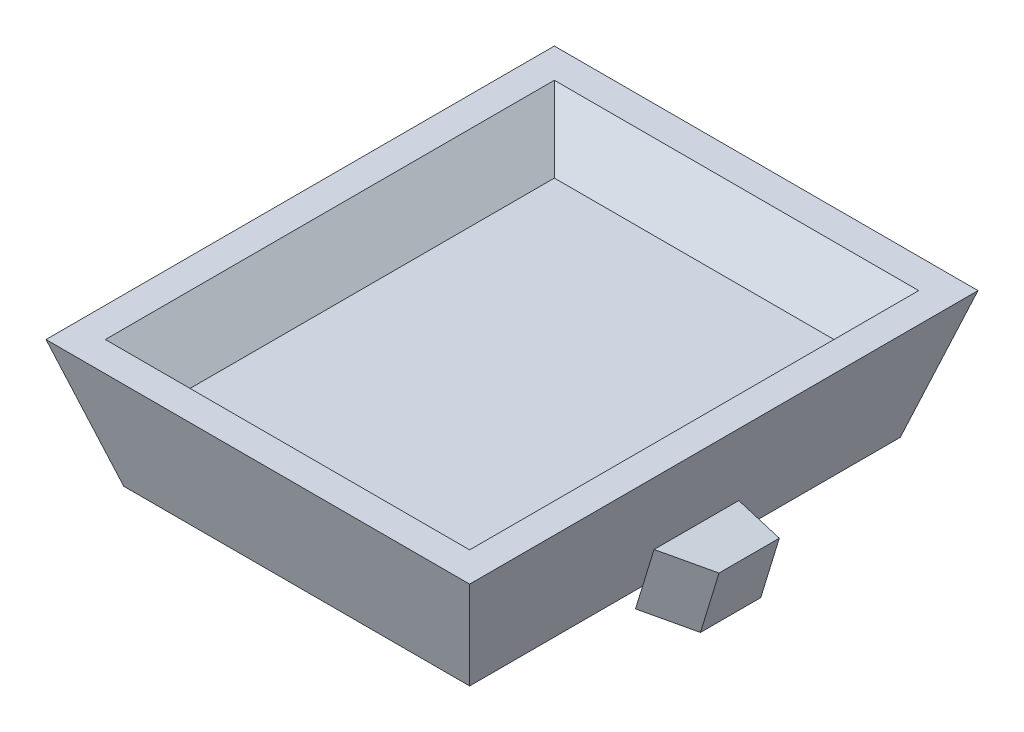
ISO-10303-21;
HEADER;
FILE_DESCRIPTION(('STEP AP214'),'2;1');
FILE_NAME('part.step','',(''),(''),'','','');
FILE_SCHEMA(('AUTOMOTIVE_DESIGN { 1 0 10303 214 1 1 1 1 }'));
ENDSEC;
DATA;
#1=APPLICATION_CONTEXT('core data for automotive mechanical design processes');
#2=APPLICATION_PROTOCOL_DEFINITION('international standard','automotive_design',2000,#1);
#3=PRODUCT_CONTEXT('',#1,'mechanical');
#4=PRODUCT('Part','Part','',(#3));
#5=PRODUCT_RELATED_PRODUCT_CATEGORY('part','',(#4));
#6=PRODUCT_DEFINITION_FORMATION('','',#4);
#7=PRODUCT_DEFINITION_CONTEXT('part definition',#1,'design');
#8=PRODUCT_DEFINITION('design','',#6,#7);
#9=PRODUCT_DEFINITION_SHAPE('','',#8);
#10=(LENGTH_UNIT() NAMED_UNIT(*) SI_UNIT(.MILLI.,.METRE.));
#11=(NAMED_UNIT(*) PLANE_ANGLE_UNIT() SI_UNIT($,.RADIAN.));
#12=(NAMED_UNIT(*) SI_UNIT($,.STERADIAN.) SOLID_ANGLE_UNIT());
#13=UNCERTAINTY_MEASURE_WITH_UNIT(LENGTH_MEASURE(1.E-05),#10,'distance_accuracy_value','');
#14=(GEOMETRIC_REPRESENTATION_CONTEXT(3) GLOBAL_UNCERTAINTY_ASSIGNED_CONTEXT((#13)) GLOBAL_UNIT_ASSIGNED_CONTEXT((#10,
#11,#12)) REPRESENTATION_CONTEXT('',''));
#15=CARTESIAN_POINT('',(0.,0.,0.));
#16=DIRECTION('',(0.,0.,1.));
#17=DIRECTION('',(1.,0.,0.));
#18=AXIS2_PLACEMENT_3D('',#15,#16,#17);
#19=CARTESIAN_POINT('',(50.,0.,-60.));
#20=DIRECTION('',(0.956304755963035,-0.292371704722737,0.));
#21=DIRECTION('',(0.292371704722737,0.956304755963036,0.));
#22=AXIS2_PLACEMENT_3D('',#19,#20,#21);
#23=PLANE('',#22);
#24=DIRECTION('',(0.292371704722737,0.956304755963035,0.));
#25=VECTOR('',#24,1.);
#26=CARTESIAN_POINT('',(39.1475759576145,-35.496679595937,-10.));
#27=LINE('',#26,#25);
#28=CARTESIAN_POINT('',(40.8280795562402,-30.,-10.));
#29=VERTEX_POINT('',#28);
#30=CARTESIAN_POINT('',(43.5331515284555,-21.1521082564914,-10.));
#31=VERTEX_POINT('',#30);
#32=EDGE_CURVE('E11',#29,#31,#27,.T.);
#33=ORIENTED_EDGE('',*,*,#32,.F.);
#34=DIRECTION('',(0.,0.,-1.));
#35=VECTOR('',#34,1.);
#36=CARTESIAN_POINT('',(40.8280795562402,-30.,0.));
#37=LINE('',#36,#35);
#38=CARTESIAN_POINT('',(40.8280795562402,-30.,-50.8280795562402));
#39=VERTEX_POINT('',#38);
#40=EDGE_CURVE('E142',#29,#39,#37,.T.);
#41=ORIENTED_EDGE('',*,*,#40,.T.);
#42=DIRECTION('',(0.280623595142128,0.917878420979061,-0.280623595142128));
#43=VECTOR('',#42,1.);
#44=CARTESIAN_POINT('',(50.,0.,-60.));
#45=LINE('',#44,#43);
#46=CARTESIAN_POINT('',(50.,0.,-60.));
#47=VERTEX_POINT('',#46);
#48=EDGE_CURVE('E200',#39,#47,#45,.T.);
#49=ORIENTED_EDGE('',*,*,#48,.T.);
#50=DIRECTION('',(0.,0.,-1.));
#51=VECTOR('',#50,1.);
#52=CARTESIAN_POINT('',(50.,0.,-60.));
#53=LINE('',#52,#51);
#54=CARTESIAN_POINT('',(50.,0.,60.));
#55=VERTEX_POINT('',#54);
#56=EDGE_CURVE('E185',#55,#47,#53,.T.);
#57=ORIENTED_EDGE('',*,*,#56,.F.);
#58=DIRECTION('',(0.280623595142128,0.917878420979061,0.280623595142128));
#59=VECTOR('',#58,1.);
#60=CARTESIAN_POINT('',(42.1250397849507,-25.7578342398524,52.1250397849507));
#61=LINE('',#60,#59);
#62=CARTESIAN_POINT('',(40.8280795562402,-30.,50.8280795562402));
#63=VERTEX_POINT('',#62);
#64=EDGE_CURVE('E45',#63,#55,#61,.T.);
#65=ORIENTED_EDGE('',*,*,#64,.F.);
#66=CARTESIAN_POINT('',(40.8280795562402,-30.,9.99999999999999));
#67=VERTEX_POINT('',#66);
#68=EDGE_CURVE('E139',#63,#67,#37,.T.);
#69=ORIENTED_EDGE('',*,*,#68,.T.);
#70=DIRECTION('',(-0.292371704722737,-0.956304755963035,0.));
#71=VECTOR('',#70,1.);
#72=CARTESIAN_POINT('',(39.1475759576145,-35.496679595937,9.99999999999999));
#73=LINE('',#72,#71);
#74=CARTESIAN_POINT('',(43.5331515284555,-21.1521082564914,9.99999999999999));
#75=VERTEX_POINT('',#74);
#76=EDGE_CURVE('E149',#75,#67,#73,.T.);
#77=ORIENTED_EDGE('',*,*,#76,.F.);
#78=DIRECTION('',(0.,0.,1.));
#79=VECTOR('',#78,1.);
#80=CARTESIAN_POINT('',(43.5331515284555,-21.1521082564914,9.99999999999999));
#81=LINE('',#80,#79);
#82=EDGE_CURVE('E55',#31,#75,#81,.T.);
#83=ORIENTED_EDGE('',*,*,#82,.F.);
#84=EDGE_LOOP('',(#33,#41,#49,#57,#65,#69,#77,#83));
#85=FACE_BOUND('',#84,.T.);
#86=ADVANCED_FACE('F35',(#85),#23,.T.);
#87=CARTESIAN_POINT('',(-50.,0.,60.));
#88=DIRECTION('',(0.,-0.292371704722737,0.956304755963035));
#89=DIRECTION('',(0.,-0.956304755963035,-0.292371704722737));
#90=AXIS2_PLACEMENT_3D('',#87,#88,#89);
#91=PLANE('',#90);
#92=DIRECTION('',(1.,0.,0.));
#93=VECTOR('',#92,1.);
#94=CARTESIAN_POINT('',(-50.,0.,60.));
#95=LINE('',#94,#93);
#96=CARTESIAN_POINT('',(-50.,0.,60.));
#97=VERTEX_POINT('',#96);
#98=EDGE_CURVE('E195',#97,#55,#95,.T.);
#99=ORIENTED_EDGE('',*,*,#98,.F.);
#100=DIRECTION('',(-0.280623595142128,0.917878420979061,0.280623595142128));
#101=VECTOR('',#100,1.);
#102=CARTESIAN_POINT('',(-40.5500477419409,-30.9094010878228,50.5500477419409));
#103=LINE('',#102,#101);
#104=CARTESIAN_POINT('',(-40.8280795562402,-30.,50.8280795562402));
#105=VERTEX_POINT('',#104);
#106=EDGE_CURVE('E199',#105,#97,#103,.T.);
#107=ORIENTED_EDGE('',*,*,#106,.F.);
#108=DIRECTION('',(1.,0.,0.));
#109=VECTOR('',#108,1.);
#110=CARTESIAN_POINT('',(0.,-30.,50.8280795562402));
#111=LINE('',#110,#109);
#112=EDGE_CURVE('E203',#105,#63,#111,.T.);
#113=ORIENTED_EDGE('',*,*,#112,.T.);
#114=ORIENTED_EDGE('',*,*,#64,.T.);
#115=EDGE_LOOP('',(#99,#107,#113,#114));
#116=FACE_BOUND('',#115,.T.);
#117=ADVANCED_FACE('F257',(#116),#91,.T.);
#118=CARTESIAN_POINT('',(-50.,0.,-60.));
#119=DIRECTION('',(-0.956304755963035,-0.292371704722737,0.));
#120=DIRECTION('',(0.292371704722737,-0.956304755963036,0.));
#121=AXIS2_PLACEMENT_3D('',#118,#119,#120);
#122=PLANE('',#121);
#123=DIRECTION('',(0.,0.,1.));
#124=VECTOR('',#123,1.);
#125=CARTESIAN_POINT('',(-50.,0.,-60.));
#126=LINE('',#125,#124);
#127=CARTESIAN_POINT('',(-50.,0.,-60.));
#128=VERTEX_POINT('',#127);
#129=EDGE_CURVE('E192',#128,#97,#126,.T.);
#130=ORIENTED_EDGE('',*,*,#129,.F.);
#131=DIRECTION('',(-0.280623595142128,0.917878420979061,-0.280623595142128));
#132=VECTOR('',#131,1.);
#133=CARTESIAN_POINT('',(-50.,0.,-60.));
#134=LINE('',#133,#132);
#135=CARTESIAN_POINT('',(-40.8280795562402,-30.,-50.8280795562402));
#136=VERTEX_POINT('',#135);
#137=EDGE_CURVE('E202',#136,#128,#134,.T.);
#138=ORIENTED_EDGE('',*,*,#137,.F.);
#139=DIRECTION('',(0.,0.,1.));
#140=VECTOR('',#139,1.);
#141=CARTESIAN_POINT('',(-40.8280795562402,-30.,0.));
#142=LINE('',#141,#140);
#143=EDGE_CURVE('E207',#136,#105,#142,.T.);
#144=ORIENTED_EDGE('',*,*,#143,.T.);
#145=ORIENTED_EDGE('',*,*,#106,.T.);
#146=EDGE_LOOP('',(#130,#138,#144,#145));
#147=FACE_BOUND('',#146,.T.);
#148=ADVANCED_FACE('F252',(#147),#122,.T.);
#149=CARTESIAN_POINT('',(-50.,0.,-60.));
#150=DIRECTION('',(0.,-0.292371704722737,-0.956304755963035));
#151=DIRECTION('',(0.,0.956304755963035,-0.292371704722737));
#152=AXIS2_PLACEMENT_3D('',#149,#150,#151);
#153=PLANE('',#152);
#154=DIRECTION('',(-1.,0.,0.));
#155=VECTOR('',#154,1.);
#156=CARTESIAN_POINT('',(-50.,0.,-60.));
#157=LINE('',#156,#155);
#158=EDGE_CURVE('E188',#47,#128,#157,.T.);
#159=ORIENTED_EDGE('',*,*,#158,.F.);
#160=ORIENTED_EDGE('',*,*,#48,.F.);
#161=DIRECTION('',(-1.,0.,0.));
#162=VECTOR('',#161,1.);
#163=CARTESIAN_POINT('',(0.,-30.,-50.8280795562402));
#164=LINE('',#163,#162);
#165=EDGE_CURVE('E151',#39,#136,#164,.T.);
#166=ORIENTED_EDGE('',*,*,#165,.T.);
#167=ORIENTED_EDGE('',*,*,#137,.T.);
#168=EDGE_LOOP('',(#159,#160,#166,#167));
#169=FACE_BOUND('',#168,.T.);
#170=ADVANCED_FACE('F248',(#169),#153,.T.);
#171=CARTESIAN_POINT('',(0.,-30.,0.));
#172=DIRECTION('',(0.,1.,0.));
#173=DIRECTION('',(0.,0.,1.));
#174=AXIS2_PLACEMENT_3D('',#171,#172,#173);
#175=PLANE('',#174);
#176=ORIENTED_EDGE('',*,*,#68,.F.);
#177=ORIENTED_EDGE('',*,*,#112,.F.);
#178=ORIENTED_EDGE('',*,*,#143,.F.);
#179=ORIENTED_EDGE('',*,*,#165,.F.);
#180=ORIENTED_EDGE('',*,*,#40,.F.);
#181=EDGE_CURVE('E135',#67,#29,#37,.T.);
#182=ORIENTED_EDGE('',*,*,#181,.F.);
#183=EDGE_LOOP('',(#176,#177,#178,#179,#180,#182));
#184=FACE_BOUND('',#183,.T.);
#185=ADVANCED_FACE('F137',(#184),#175,.F.);
#186=CARTESIAN_POINT('',(0.,0.,0.));
#187=DIRECTION('',(0.,1.,0.));
#188=DIRECTION('',(0.,0.,1.));
#189=AXIS2_PLACEMENT_3D('',#186,#187,#188);
#190=PLANE('',#189);
#191=DIRECTION('',(0.,0.,-1.));
#192=VECTOR('',#191,1.);
#193=CARTESIAN_POINT('',(43.,0.,53.));
#194=LINE('',#193,#192);
#195=CARTESIAN_POINT('',(43.,0.,53.));
#196=VERTEX_POINT('',#195);
#197=CARTESIAN_POINT('',(43.,0.,-53.));
#198=VERTEX_POINT('',#197);
#199=EDGE_CURVE('E173',#196,#198,#194,.T.);
#200=ORIENTED_EDGE('',*,*,#199,.F.);
#201=DIRECTION('',(1.,0.,0.));
#202=VECTOR('',#201,1.);
#203=CARTESIAN_POINT('',(-43.,0.,53.));
#204=LINE('',#203,#202);
#205=CARTESIAN_POINT('',(-43.,0.,53.));
#206=VERTEX_POINT('',#205);
#207=EDGE_CURVE('E181',#206,#196,#204,.T.);
#208=ORIENTED_EDGE('',*,*,#207,.F.);
#209=DIRECTION('',(0.,0.,1.));
#210=VECTOR('',#209,1.);
#211=CARTESIAN_POINT('',(-43.,0.,53.));
#212=LINE('',#211,#210);
#213=CARTESIAN_POINT('',(-43.,0.,-53.));
#214=VERTEX_POINT('',#213);
#215=EDGE_CURVE('E178',#214,#206,#212,.T.);
#216=ORIENTED_EDGE('',*,*,#215,.F.);
#217=DIRECTION('',(-1.,0.,0.));
#218=VECTOR('',#217,1.);
#219=CARTESIAN_POINT('',(-43.,0.,-53.));
#220=LINE('',#219,#218);
#221=EDGE_CURVE('E175',#198,#214,#220,.T.);
#222=ORIENTED_EDGE('',*,*,#221,.F.);
#223=EDGE_LOOP('',(#200,#208,#216,#222));
#224=FACE_BOUND('',#223,.T.);
#225=ORIENTED_EDGE('',*,*,#56,.T.);
#226=ORIENTED_EDGE('',*,*,#158,.T.);
#227=ORIENTED_EDGE('',*,*,#129,.T.);
#228=ORIENTED_EDGE('',*,*,#98,.T.);
#229=EDGE_LOOP('',(#225,#226,#227,#228));
#230=FACE_BOUND('',#229,.T.);
#231=ADVANCED_FACE('F255',(#224,#230),#190,.T.);
#232=CARTESIAN_POINT('',(43.,0.,53.));
#233=DIRECTION('',(-0.707106781186546,0.707106781186549,0.));
#234=DIRECTION('',(-0.707106781186549,-0.707106781186546,0.));
#235=AXIS2_PLACEMENT_3D('',#232,#233,#234);
#236=PLANE('',#235);
#237=ORIENTED_EDGE('',*,*,#199,.T.);
#238=DIRECTION('',(0.577350269189627,0.577350269189624,-0.577350269189627));
#239=VECTOR('',#238,1.);
#240=CARTESIAN_POINT('',(7.66666666666657,-35.3333333333333,-17.6666666666666));
#241=LINE('',#240,#239);
#242=CARTESIAN_POINT('',(33.,-10.,-43.));
#243=VERTEX_POINT('',#242);
#244=EDGE_CURVE('E216',#243,#198,#241,.T.);
#245=ORIENTED_EDGE('',*,*,#244,.F.);
#246=DIRECTION('',(0.,0.,1.));
#247=VECTOR('',#246,1.);
#248=CARTESIAN_POINT('',(33.,-10.,53.));
#249=LINE('',#248,#247);
#250=CARTESIAN_POINT('',(33.,-10.,43.));
#251=VERTEX_POINT('',#250);
#252=EDGE_CURVE('E184',#251,#243,#249,.F.);
#253=ORIENTED_EDGE('',*,*,#252,.F.);
#254=DIRECTION('',(0.577350269189627,0.577350269189624,0.577350269189627));
#255=VECTOR('',#254,1.);
#256=CARTESIAN_POINT('',(14.3333333333333,-28.6666666666666,24.3333333333333));
#257=LINE('',#256,#255);
#258=EDGE_CURVE('E189',#251,#196,#257,.T.);
#259=ORIENTED_EDGE('',*,*,#258,.T.);
#260=EDGE_LOOP('',(#237,#245,#253,#259));
#261=FACE_BOUND('',#260,.T.);
#262=ADVANCED_FACE('F272',(#261),#236,.T.);
#263=CARTESIAN_POINT('',(-43.,0.,53.));
#264=DIRECTION('',(0.,0.707106781186549,-0.707106781186546));
#265=DIRECTION('',(0.,0.707106781186546,0.707106781186549));
#266=AXIS2_PLACEMENT_3D('',#263,#264,#265);
#267=PLANE('',#266);
#268=ORIENTED_EDGE('',*,*,#207,.T.);
#269=ORIENTED_EDGE('',*,*,#258,.F.);
#270=DIRECTION('',(-1.,0.,0.));
#271=VECTOR('',#270,1.);
#272=CARTESIAN_POINT('',(-43.,-10.,43.));
#273=LINE('',#272,#271);
#274=CARTESIAN_POINT('',(-33.,-10.,43.));
#275=VERTEX_POINT('',#274);
#276=EDGE_CURVE('E219',#275,#251,#273,.F.);
#277=ORIENTED_EDGE('',*,*,#276,.F.);
#278=DIRECTION('',(-0.577350269189627,0.577350269189624,0.577350269189627));
#279=VECTOR('',#278,1.);
#280=CARTESIAN_POINT('',(-43.,0.,53.));
#281=LINE('',#280,#279);
#282=EDGE_CURVE('E213',#275,#206,#281,.T.);
#283=ORIENTED_EDGE('',*,*,#282,.T.);
#284=EDGE_LOOP('',(#268,#269,#277,#283));
#285=FACE_BOUND('',#284,.T.);
#286=ADVANCED_FACE('F268',(#285),#267,.T.);
#287=CARTESIAN_POINT('',(-43.,0.,53.));
#288=DIRECTION('',(0.707106781186546,0.707106781186549,0.));
#289=DIRECTION('',(-0.707106781186549,0.707106781186546,0.));
#290=AXIS2_PLACEMENT_3D('',#287,#288,#289);
#291=PLANE('',#290);
#292=ORIENTED_EDGE('',*,*,#215,.T.);
#293=ORIENTED_EDGE('',*,*,#282,.F.);
#294=DIRECTION('',(0.,0.,-1.));
#295=VECTOR('',#294,1.);
#296=CARTESIAN_POINT('',(-33.,-10.,53.));
#297=LINE('',#296,#295);
#298=CARTESIAN_POINT('',(-33.,-10.,-43.));
#299=VERTEX_POINT('',#298);
#300=EDGE_CURVE('E223',#299,#275,#297,.F.);
#301=ORIENTED_EDGE('',*,*,#300,.F.);
#302=DIRECTION('',(-0.577350269189627,0.577350269189624,-0.577350269189627));
#303=VECTOR('',#302,1.);
#304=CARTESIAN_POINT('',(-43.,0.,-53.));
#305=LINE('',#304,#303);
#306=EDGE_CURVE('E215',#299,#214,#305,.T.);
#307=ORIENTED_EDGE('',*,*,#306,.T.);
#308=EDGE_LOOP('',(#292,#293,#301,#307));
#309=FACE_BOUND('',#308,.T.);
#310=ADVANCED_FACE('F271',(#309),#291,.T.);
#311=CARTESIAN_POINT('',(-43.,0.,-53.));
#312=DIRECTION('',(0.,0.707106781186549,0.707106781186546));
#313=DIRECTION('',(0.,-0.707106781186546,0.707106781186549));
#314=AXIS2_PLACEMENT_3D('',#311,#312,#313);
#315=PLANE('',#314);
#316=ORIENTED_EDGE('',*,*,#221,.T.);
#317=ORIENTED_EDGE('',*,*,#306,.F.);
#318=DIRECTION('',(1.,0.,0.));
#319=VECTOR('',#318,1.);
#320=CARTESIAN_POINT('',(-43.,-10.,-43.));
#321=LINE('',#320,#319);
#322=EDGE_CURVE('E226',#243,#299,#321,.F.);
#323=ORIENTED_EDGE('',*,*,#322,.F.);
#324=ORIENTED_EDGE('',*,*,#244,.T.);
#325=EDGE_LOOP('',(#316,#317,#323,#324));
#326=FACE_BOUND('',#325,.T.);
#327=ADVANCED_FACE('F277',(#326),#315,.T.);
#328=CARTESIAN_POINT('',(0.,-10.,0.));
#329=DIRECTION('',(0.,-1.,0.));
#330=DIRECTION('',(0.,0.,-1.));
#331=AXIS2_PLACEMENT_3D('',#328,#329,#330);
#332=PLANE('',#331);
#333=ORIENTED_EDGE('',*,*,#252,.T.);
#334=ORIENTED_EDGE('',*,*,#322,.T.);
#335=ORIENTED_EDGE('',*,*,#300,.T.);
#336=ORIENTED_EDGE('',*,*,#276,.T.);
#337=EDGE_LOOP('',(#333,#334,#335,#336));
#338=FACE_BOUND('',#337,.T.);
#339=ADVANCED_FACE('F279',(#338),#332,.F.);
#340=CARTESIAN_POINT('',(48.7106235172448,-38.4203966431643,-10.));
#341=DIRECTION('',(0.,0.,1.));
#342=DIRECTION('',(1.,0.,0.));
#343=AXIS2_PLACEMENT_3D('',#340,#341,#342);
#344=PLANE('',#343);
#345=CARTESIAN_POINT('',(39.1475759576145,-35.496679595937,-10.));
#346=VERTEX_POINT('',#345);
#347=EDGE_CURVE('E47',#346,#29,#27,.T.);
#348=ORIENTED_EDGE('',*,*,#347,.T.);
#349=ORIENTED_EDGE('',*,*,#32,.T.);
#350=DIRECTION('',(-0.956304755963035,0.292371704722737,0.));
#351=VECTOR('',#350,1.);
#352=CARTESIAN_POINT('',(53.0961990880859,-24.0758253037188,-10.));
#353=LINE('',#352,#351);
#354=CARTESIAN_POINT('',(53.0961990880859,-24.0758253037188,-10.));
#355=VERTEX_POINT('',#354);
#356=EDGE_CURVE('E170',#355,#31,#353,.T.);
#357=ORIENTED_EDGE('',*,*,#356,.F.);
#358=DIRECTION('',(0.292371704722737,0.956304755963035,0.));
#359=VECTOR('',#358,1.);
#360=CARTESIAN_POINT('',(48.7106235172448,-38.4203966431643,-10.));
#361=LINE('',#360,#359);
#362=CARTESIAN_POINT('',(48.7106235172448,-38.4203966431643,-10.));
#363=VERTEX_POINT('',#362);
#364=EDGE_CURVE('E162',#363,#355,#361,.T.);
#365=ORIENTED_EDGE('',*,*,#364,.F.);
#366=DIRECTION('',(-0.956304755963035,0.292371704722737,0.));
#367=VECTOR('',#366,1.);
#368=CARTESIAN_POINT('',(48.7106235172448,-38.4203966431643,-10.));
#369=LINE('',#368,#367);
#370=EDGE_CURVE('E166',#363,#346,#369,.T.);
#371=ORIENTED_EDGE('',*,*,#370,.T.);
#372=EDGE_LOOP('',(#348,#349,#357,#365,#371));
#373=FACE_BOUND('',#372,.T.);
#374=ADVANCED_FACE('F244',(#373),#344,.F.);
#375=CARTESIAN_POINT('',(53.0961990880859,-24.0758253037188,9.99999999999999));
#376=DIRECTION('',(-0.292371704722737,-0.956304755963035,0.));
#377=DIRECTION('',(0.956304755963035,-0.292371704722737,0.));
#378=AXIS2_PLACEMENT_3D('',#375,#376,#377);
#379=PLANE('',#378);
#380=ORIENTED_EDGE('',*,*,#82,.T.);
#381=DIRECTION('',(0.828184212423866,-0.253201323637653,-0.500000000000001));
#382=VECTOR('',#381,1.);
#383=CARTESIAN_POINT('',(43.5331515284555,-21.1521082564914,9.99999999999999));
#384=LINE('',#383,#382);
#385=CARTESIAN_POINT('',(53.0961990880859,-24.0758253037188,4.22649730810372));
#386=VERTEX_POINT('',#385);
#387=EDGE_CURVE('E160',#386,#75,#384,.F.);
#388=ORIENTED_EDGE('',*,*,#387,.F.);
#389=DIRECTION('',(0.,0.,1.));
#390=VECTOR('',#389,1.);
#391=CARTESIAN_POINT('',(53.0961990880859,-24.0758253037188,9.99999999999999));
#392=LINE('',#391,#390);
#393=EDGE_CURVE('E232',#355,#386,#392,.T.);
#394=ORIENTED_EDGE('',*,*,#393,.F.);
#395=ORIENTED_EDGE('',*,*,#356,.T.);
#396=EDGE_LOOP('',(#380,#388,#394,#395));
#397=FACE_BOUND('',#396,.T.);
#398=ADVANCED_FACE('F241',(#397),#379,.F.);
#399=CARTESIAN_POINT('',(39.1475759576145,-35.496679595937,9.99999999999999));
#400=DIRECTION('',(0.478152377981519,-0.146185852361369,0.866025403784438));
#401=DIRECTION('',(0.875430022626229,0.,-0.483344882547276));
#402=AXIS2_PLACEMENT_3D('',#399,#400,#401);
#403=PLANE('',#402);
#404=ORIENTED_EDGE('',*,*,#76,.T.);
#405=DIRECTION('',(0.292371704722737,0.956304755963035,0.));
#406=VECTOR('',#405,1.);
#407=CARTESIAN_POINT('',(45.7259393138761,-13.9798225867687,10.));
#408=LINE('',#407,#406);
#409=CARTESIAN_POINT('',(39.1475759576145,-35.496679595937,9.99999999999999));
#410=VERTEX_POINT('',#409);
#411=EDGE_CURVE('E39',#67,#410,#408,.F.);
#412=ORIENTED_EDGE('',*,*,#411,.T.);
#413=DIRECTION('',(0.828184212423866,-0.253201323637653,-0.500000000000001));
#414=VECTOR('',#413,1.);
#415=CARTESIAN_POINT('',(46.3198616273372,-37.6894673813575,5.66987298107779));
#416=LINE('',#415,#414);
#417=CARTESIAN_POINT('',(48.7106235172448,-38.4203966431643,4.22649730810372));
#418=VERTEX_POINT('',#417);
#419=EDGE_CURVE('E169',#418,#410,#416,.F.);
#420=ORIENTED_EDGE('',*,*,#419,.F.);
#421=DIRECTION('',(0.292371704722737,0.956304755963035,0.));
#422=VECTOR('',#421,1.);
#423=CARTESIAN_POINT('',(55.2889868735064,-16.903539633996,4.22649730810373));
#424=LINE('',#423,#422);
#425=EDGE_CURVE('E83',#386,#418,#424,.F.);
#426=ORIENTED_EDGE('',*,*,#425,.F.);
#427=ORIENTED_EDGE('',*,*,#387,.T.);
#428=EDGE_LOOP('',(#404,#412,#420,#426,#427));
#429=FACE_BOUND('',#428,.T.);
#430=ADVANCED_FACE('F37',(#429),#403,.T.);
#431=CARTESIAN_POINT('',(48.7106235172448,-38.4203966431643,9.99999999999999));
#432=DIRECTION('',(0.292371704722737,0.956304755963035,0.));
#433=DIRECTION('',(-0.956304755963035,0.292371704722737,0.));
#434=AXIS2_PLACEMENT_3D('',#431,#432,#433);
#435=PLANE('',#434);
#436=DIRECTION('',(0.,0.,-1.));
#437=VECTOR('',#436,1.);
#438=CARTESIAN_POINT('',(39.1475759576145,-35.496679595937,9.99999999999999));
#439=LINE('',#438,#437);
#440=EDGE_CURVE('E155',#410,#346,#439,.T.);
#441=ORIENTED_EDGE('',*,*,#440,.T.);
#442=ORIENTED_EDGE('',*,*,#370,.F.);
#443=DIRECTION('',(0.,0.,-1.));
#444=VECTOR('',#443,1.);
#445=CARTESIAN_POINT('',(48.7106235172448,-38.4203966431643,9.99999999999999));
#446=LINE('',#445,#444);
#447=EDGE_CURVE('E89',#418,#363,#446,.T.);
#448=ORIENTED_EDGE('',*,*,#447,.F.);
#449=ORIENTED_EDGE('',*,*,#419,.T.);
#450=EDGE_LOOP('',(#441,#442,#448,#449));
#451=FACE_BOUND('',#450,.T.);
#452=ADVANCED_FACE('F234',(#451),#435,.F.);
#453=CARTESIAN_POINT('',(55.2889868735064,-16.903539633996,0.));
#454=DIRECTION('',(-0.956304755963035,0.292371704722737,0.));
#455=DIRECTION('',(-0.292371704722737,-0.956304755963035,0.));
#456=AXIS2_PLACEMENT_3D('',#453,#454,#455);
#457=PLANE('',#456);
#458=ORIENTED_EDGE('',*,*,#364,.T.);
#459=ORIENTED_EDGE('',*,*,#393,.T.);
#460=ORIENTED_EDGE('',*,*,#425,.T.);
#461=ORIENTED_EDGE('',*,*,#447,.T.);
#462=EDGE_LOOP('',(#458,#459,#460,#461));
#463=FACE_BOUND('',#462,.T.);
#464=ADVANCED_FACE('F367',(#463),#457,.F.);
#465=CARTESIAN_POINT('',(45.7259393138761,-13.9798225867687,0.));
#466=DIRECTION('',(-0.956304755963035,0.292371704722737,0.));
#467=DIRECTION('',(-0.292371704722737,-0.956304755963035,0.));
#468=AXIS2_PLACEMENT_3D('',#465,#466,#467);
#469=PLANE('',#468);
#470=ORIENTED_EDGE('',*,*,#411,.F.);
#471=ORIENTED_EDGE('',*,*,#181,.T.);
#472=ORIENTED_EDGE('',*,*,#347,.F.);
#473=ORIENTED_EDGE('',*,*,#440,.F.);
#474=EDGE_LOOP('',(#470,#471,#472,#473));
#475=FACE_BOUND('',#474,.T.);
#476=ADVANCED_FACE('F154',(#475),#469,.T.);
#477=CLOSED_SHELL('',(#86,#117,#148,#170,#185,#231,#262,#286,#310,#327,#339,#374,#398,#430,#452,
#464,#476));
#478=MANIFOLD_SOLID_BREP('B2',#477);
#479=ADVANCED_BREP_SHAPE_REPRESENTATION('',(#18,#478),#14);
#480=SHAPE_DEFINITION_REPRESENTATION(#9,#479);
ENDSEC;
END-ISO-10303-21;
